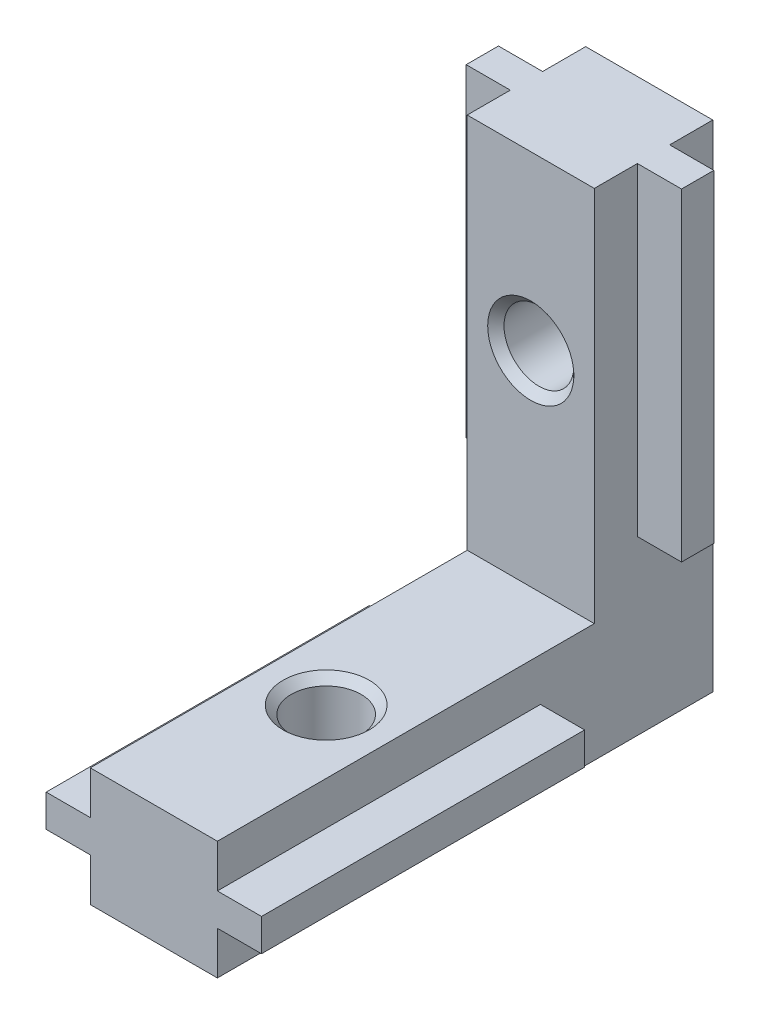
ISO-10303-21;
HEADER;
FILE_DESCRIPTION(('STEP AP214'),'2;1');
FILE_NAME('part.step','',(''),(''),'','','');
FILE_SCHEMA(('AUTOMOTIVE_DESIGN { 1 0 10303 214 1 1 1 1 }'));
ENDSEC;
DATA;
#1=APPLICATION_CONTEXT('core data for automotive mechanical design processes');
#2=APPLICATION_PROTOCOL_DEFINITION('international standard','automotive_design',2000,#1);
#3=PRODUCT_CONTEXT('',#1,'mechanical');
#4=PRODUCT('Part','Part','',(#3));
#5=PRODUCT_RELATED_PRODUCT_CATEGORY('part','',(#4));
#6=PRODUCT_DEFINITION_FORMATION('','',#4);
#7=PRODUCT_DEFINITION_CONTEXT('part definition',#1,'design');
#8=PRODUCT_DEFINITION('design','',#6,#7);
#9=PRODUCT_DEFINITION_SHAPE('','',#8);
#10=(LENGTH_UNIT() NAMED_UNIT(*) SI_UNIT(.MILLI.,.METRE.));
#11=(NAMED_UNIT(*) PLANE_ANGLE_UNIT() SI_UNIT($,.RADIAN.));
#12=(NAMED_UNIT(*) SI_UNIT($,.STERADIAN.) SOLID_ANGLE_UNIT());
#13=UNCERTAINTY_MEASURE_WITH_UNIT(LENGTH_MEASURE(1.E-05),#10,'distance_accuracy_value','');
#14=(GEOMETRIC_REPRESENTATION_CONTEXT(3) GLOBAL_UNCERTAINTY_ASSIGNED_CONTEXT((#13)) GLOBAL_UNIT_ASSIGNED_CONTEXT((#10,
#11,#12)) REPRESENTATION_CONTEXT('',''));
#15=CARTESIAN_POINT('',(0.,0.,0.));
#16=DIRECTION('',(0.,0.,1.));
#17=DIRECTION('',(1.,0.,0.));
#18=AXIS2_PLACEMENT_3D('',#15,#16,#17);
#19=CARTESIAN_POINT('',(2.95,5.5,23.));
#20=DIRECTION('',(0.,-1.,0.));
#21=DIRECTION('',(0.,0.,-1.));
#22=AXIS2_PLACEMENT_3D('',#19,#20,#21);
#23=PLANE('',#22);
#24=CARTESIAN_POINT('',(0.,5.5,15.));
#25=DIRECTION('',(0.,1.,0.));
#26=DIRECTION('',(0.,0.,1.));
#27=AXIS2_PLACEMENT_3D('',#24,#25,#26);
#28=CIRCLE('',#27,2.);
#29=CARTESIAN_POINT('',(0.,5.5,17.));
#30=VERTEX_POINT('',#29);
#31=EDGE_CURVE('E417',#30,#30,#28,.T.);
#32=ORIENTED_EDGE('',*,*,#31,.F.);
#33=EDGE_LOOP('',(#32));
#34=FACE_BOUND('',#33,.T.);
#35=DIRECTION('',(1.,0.,0.));
#36=VECTOR('',#35,1.);
#37=CARTESIAN_POINT('',(2.95,5.5,5.5));
#38=LINE('',#37,#36);
#39=CARTESIAN_POINT('',(-2.95,5.5,5.5));
#40=VERTEX_POINT('',#39);
#41=CARTESIAN_POINT('',(2.95,5.5,5.5));
#42=VERTEX_POINT('',#41);
#43=EDGE_CURVE('E24',#40,#42,#38,.T.);
#44=ORIENTED_EDGE('',*,*,#43,.F.);
#45=DIRECTION('',(0.,0.,-1.));
#46=VECTOR('',#45,1.);
#47=CARTESIAN_POINT('',(-2.95,5.5,23.));
#48=LINE('',#47,#46);
#49=CARTESIAN_POINT('',(-2.95,5.5,23.));
#50=VERTEX_POINT('',#49);
#51=EDGE_CURVE('E306',#50,#40,#48,.T.);
#52=ORIENTED_EDGE('',*,*,#51,.F.);
#53=DIRECTION('',(-1.,0.,0.));
#54=VECTOR('',#53,1.);
#55=CARTESIAN_POINT('',(2.95,5.5,23.));
#56=LINE('',#55,#54);
#57=CARTESIAN_POINT('',(2.95,5.5,23.));
#58=VERTEX_POINT('',#57);
#59=EDGE_CURVE('E304',#58,#50,#56,.T.);
#60=ORIENTED_EDGE('',*,*,#59,.F.);
#61=DIRECTION('',(0.,0.,-1.));
#62=VECTOR('',#61,1.);
#63=CARTESIAN_POINT('',(2.95,5.5,23.));
#64=LINE('',#63,#62);
#65=EDGE_CURVE('E317',#58,#42,#64,.T.);
#66=ORIENTED_EDGE('',*,*,#65,.T.);
#67=EDGE_LOOP('',(#44,#52,#60,#66));
#68=FACE_BOUND('',#67,.T.);
#69=ADVANCED_FACE('F16',(#34,#68),#23,.F.);
#70=CARTESIAN_POINT('',(-2.95,5.5,23.));
#71=DIRECTION('',(1.,0.,0.));
#72=DIRECTION('',(0.,0.,-1.));
#73=AXIS2_PLACEMENT_3D('',#70,#71,#72);
#74=PLANE('',#73);
#75=DIRECTION('',(0.,0.,1.));
#76=VECTOR('',#75,1.);
#77=CARTESIAN_POINT('',(-2.95,23.,0.));
#78=LINE('',#77,#76);
#79=CARTESIAN_POINT('',(-2.95,23.,3.5));
#80=VERTEX_POINT('',#79);
#81=CARTESIAN_POINT('',(-2.95,23.,5.5));
#82=VERTEX_POINT('',#81);
#83=EDGE_CURVE('E224',#80,#82,#78,.T.);
#84=ORIENTED_EDGE('',*,*,#83,.F.);
#85=DIRECTION('',(0.,-1.,0.));
#86=VECTOR('',#85,1.);
#87=CARTESIAN_POINT('',(-2.95,5.5,3.5));
#88=LINE('',#87,#86);
#89=CARTESIAN_POINT('',(-2.95,8.,3.5));
#90=VERTEX_POINT('',#89);
#91=EDGE_CURVE('E221',#80,#90,#88,.T.);
#92=ORIENTED_EDGE('',*,*,#91,.T.);
#93=DIRECTION('',(0.,0.,1.));
#94=VECTOR('',#93,1.);
#95=CARTESIAN_POINT('',(-2.95,8.,23.));
#96=LINE('',#95,#94);
#97=CARTESIAN_POINT('',(-2.95,8.,2.));
#98=VERTEX_POINT('',#97);
#99=EDGE_CURVE('E181',#98,#90,#96,.T.);
#100=ORIENTED_EDGE('',*,*,#99,.F.);
#101=DIRECTION('',(0.,1.,0.));
#102=VECTOR('',#101,1.);
#103=CARTESIAN_POINT('',(-2.95,5.5,2.));
#104=LINE('',#103,#102);
#105=CARTESIAN_POINT('',(-2.95,23.,2.));
#106=VERTEX_POINT('',#105);
#107=EDGE_CURVE('E215',#98,#106,#104,.T.);
#108=ORIENTED_EDGE('',*,*,#107,.T.);
#109=CARTESIAN_POINT('',(-2.95,23.,0.));
#110=VERTEX_POINT('',#109);
#111=EDGE_CURVE('E225',#110,#106,#78,.T.);
#112=ORIENTED_EDGE('',*,*,#111,.F.);
#113=DIRECTION('',(0.,-1.,0.));
#114=VECTOR('',#113,1.);
#115=CARTESIAN_POINT('',(-2.95,5.5,0.));
#116=LINE('',#115,#114);
#117=CARTESIAN_POINT('',(-2.95,0.,0.));
#118=VERTEX_POINT('',#117);
#119=EDGE_CURVE('E293',#110,#118,#116,.T.);
#120=ORIENTED_EDGE('',*,*,#119,.T.);
#121=DIRECTION('',(0.,0.,-1.));
#122=VECTOR('',#121,1.);
#123=CARTESIAN_POINT('',(-2.95,0.,23.));
#124=LINE('',#123,#122);
#125=CARTESIAN_POINT('',(-2.95,0.,23.));
#126=VERTEX_POINT('',#125);
#127=EDGE_CURVE('E321',#126,#118,#124,.T.);
#128=ORIENTED_EDGE('',*,*,#127,.F.);
#129=DIRECTION('',(0.,-1.,0.));
#130=VECTOR('',#129,1.);
#131=CARTESIAN_POINT('',(-2.95,5.5,23.));
#132=LINE('',#131,#130);
#133=CARTESIAN_POINT('',(-2.95,2.,23.));
#134=VERTEX_POINT('',#133);
#135=EDGE_CURVE('E298',#134,#126,#132,.T.);
#136=ORIENTED_EDGE('',*,*,#135,.F.);
#137=DIRECTION('',(0.,0.,-1.));
#138=VECTOR('',#137,1.);
#139=CARTESIAN_POINT('',(-2.95,2.,23.));
#140=LINE('',#139,#138);
#141=CARTESIAN_POINT('',(-2.95,2.,8.));
#142=VERTEX_POINT('',#141);
#143=EDGE_CURVE('E288',#134,#142,#140,.T.);
#144=ORIENTED_EDGE('',*,*,#143,.T.);
#145=DIRECTION('',(0.,-1.,0.));
#146=VECTOR('',#145,1.);
#147=CARTESIAN_POINT('',(-2.95,5.5,8.));
#148=LINE('',#147,#146);
#149=CARTESIAN_POINT('',(-2.95,3.5,8.));
#150=VERTEX_POINT('',#149);
#151=EDGE_CURVE('E291',#150,#142,#148,.T.);
#152=ORIENTED_EDGE('',*,*,#151,.F.);
#153=DIRECTION('',(0.,0.,1.));
#154=VECTOR('',#153,1.);
#155=CARTESIAN_POINT('',(-2.95,3.5,23.));
#156=LINE('',#155,#154);
#157=CARTESIAN_POINT('',(-2.95,3.5,23.));
#158=VERTEX_POINT('',#157);
#159=EDGE_CURVE('E282',#150,#158,#156,.T.);
#160=ORIENTED_EDGE('',*,*,#159,.T.);
#161=EDGE_CURVE('E294',#50,#158,#132,.T.);
#162=ORIENTED_EDGE('',*,*,#161,.F.);
#163=ORIENTED_EDGE('',*,*,#51,.T.);
#164=DIRECTION('',(0.,-1.,0.));
#165=VECTOR('',#164,1.);
#166=CARTESIAN_POINT('',(-2.95,23.,5.5));
#167=LINE('',#166,#165);
#168=EDGE_CURVE('E240',#82,#40,#167,.T.);
#169=ORIENTED_EDGE('',*,*,#168,.F.);
#170=EDGE_LOOP('',(#84,#92,#100,#108,#112,#120,#128,#136,#144,#152,#160,#162,#163,#169));
#171=FACE_BOUND('',#170,.T.);
#172=ADVANCED_FACE('F18',(#171),#74,.F.);
#173=CARTESIAN_POINT('',(-2.95,0.,23.));
#174=DIRECTION('',(0.,1.,0.));
#175=DIRECTION('',(0.,0.,1.));
#176=AXIS2_PLACEMENT_3D('',#173,#174,#175);
#177=PLANE('',#176);
#178=CARTESIAN_POINT('',(0.,0.,15.));
#179=DIRECTION('',(0.,1.,0.));
#180=DIRECTION('',(0.,0.,1.));
#181=AXIS2_PLACEMENT_3D('',#178,#179,#180);
#182=CIRCLE('',#181,2.);
#183=CARTESIAN_POINT('',(0.,0.,17.));
#184=VERTEX_POINT('',#183);
#185=EDGE_CURVE('E193',#184,#184,#182,.T.);
#186=ORIENTED_EDGE('',*,*,#185,.T.);
#187=EDGE_LOOP('',(#186));
#188=FACE_BOUND('',#187,.T.);
#189=DIRECTION('',(1.,0.,0.));
#190=VECTOR('',#189,1.);
#191=CARTESIAN_POINT('',(-2.95,0.,0.));
#192=LINE('',#191,#190);
#193=CARTESIAN_POINT('',(2.95,0.,0.));
#194=VERTEX_POINT('',#193);
#195=EDGE_CURVE('E309',#118,#194,#192,.T.);
#196=ORIENTED_EDGE('',*,*,#195,.T.);
#197=DIRECTION('',(0.,0.,-1.));
#198=VECTOR('',#197,1.);
#199=CARTESIAN_POINT('',(2.95,0.,23.));
#200=LINE('',#199,#198);
#201=CARTESIAN_POINT('',(2.95,0.,23.));
#202=VERTEX_POINT('',#201);
#203=EDGE_CURVE('E319',#202,#194,#200,.T.);
#204=ORIENTED_EDGE('',*,*,#203,.F.);
#205=DIRECTION('',(1.,0.,0.));
#206=VECTOR('',#205,1.);
#207=CARTESIAN_POINT('',(-2.95,0.,23.));
#208=LINE('',#207,#206);
#209=EDGE_CURVE('E297',#126,#202,#208,.T.);
#210=ORIENTED_EDGE('',*,*,#209,.F.);
#211=ORIENTED_EDGE('',*,*,#127,.T.);
#212=EDGE_LOOP('',(#196,#204,#210,#211));
#213=FACE_BOUND('',#212,.T.);
#214=ADVANCED_FACE('F369',(#188,#213),#177,.F.);
#215=CARTESIAN_POINT('',(2.95,0.,23.));
#216=DIRECTION('',(-1.,0.,0.));
#217=DIRECTION('',(0.,0.,1.));
#218=AXIS2_PLACEMENT_3D('',#215,#216,#217);
#219=PLANE('',#218);
#220=DIRECTION('',(0.,0.,-1.));
#221=VECTOR('',#220,1.);
#222=CARTESIAN_POINT('',(2.95,8.,23.));
#223=LINE('',#222,#221);
#224=CARTESIAN_POINT('',(2.95,8.,3.5));
#225=VERTEX_POINT('',#224);
#226=CARTESIAN_POINT('',(2.95,8.,2.));
#227=VERTEX_POINT('',#226);
#228=EDGE_CURVE('E11',#225,#227,#223,.T.);
#229=ORIENTED_EDGE('',*,*,#228,.F.);
#230=DIRECTION('',(0.,1.,0.));
#231=VECTOR('',#230,1.);
#232=CARTESIAN_POINT('',(2.95,0.,3.5));
#233=LINE('',#232,#231);
#234=CARTESIAN_POINT('',(2.95,23.,3.5));
#235=VERTEX_POINT('',#234);
#236=EDGE_CURVE('E218',#225,#235,#233,.T.);
#237=ORIENTED_EDGE('',*,*,#236,.T.);
#238=DIRECTION('',(0.,0.,-1.));
#239=VECTOR('',#238,1.);
#240=CARTESIAN_POINT('',(2.95,23.,5.5));
#241=LINE('',#240,#239);
#242=CARTESIAN_POINT('',(2.95,23.,5.5));
#243=VERTEX_POINT('',#242);
#244=EDGE_CURVE('E231',#243,#235,#241,.T.);
#245=ORIENTED_EDGE('',*,*,#244,.F.);
#246=DIRECTION('',(0.,-1.,0.));
#247=VECTOR('',#246,1.);
#248=CARTESIAN_POINT('',(2.95,23.,5.5));
#249=LINE('',#248,#247);
#250=EDGE_CURVE('E237',#243,#42,#249,.T.);
#251=ORIENTED_EDGE('',*,*,#250,.T.);
#252=ORIENTED_EDGE('',*,*,#65,.F.);
#253=DIRECTION('',(0.,1.,0.));
#254=VECTOR('',#253,1.);
#255=CARTESIAN_POINT('',(2.95,0.,23.));
#256=LINE('',#255,#254);
#257=CARTESIAN_POINT('',(2.95,3.5,23.));
#258=VERTEX_POINT('',#257);
#259=EDGE_CURVE('E300',#258,#58,#256,.T.);
#260=ORIENTED_EDGE('',*,*,#259,.F.);
#261=DIRECTION('',(0.,0.,-1.));
#262=VECTOR('',#261,1.);
#263=CARTESIAN_POINT('',(2.95,3.5,23.));
#264=LINE('',#263,#262);
#265=CARTESIAN_POINT('',(2.95,3.5,8.));
#266=VERTEX_POINT('',#265);
#267=EDGE_CURVE('E279',#258,#266,#264,.T.);
#268=ORIENTED_EDGE('',*,*,#267,.T.);
#269=DIRECTION('',(0.,1.,0.));
#270=VECTOR('',#269,1.);
#271=CARTESIAN_POINT('',(2.95,0.,8.));
#272=LINE('',#271,#270);
#273=CARTESIAN_POINT('',(2.95,2.,8.));
#274=VERTEX_POINT('',#273);
#275=EDGE_CURVE('E323',#274,#266,#272,.T.);
#276=ORIENTED_EDGE('',*,*,#275,.F.);
#277=DIRECTION('',(0.,0.,1.));
#278=VECTOR('',#277,1.);
#279=CARTESIAN_POINT('',(2.95,2.,23.));
#280=LINE('',#279,#278);
#281=CARTESIAN_POINT('',(2.95,2.,23.));
#282=VERTEX_POINT('',#281);
#283=EDGE_CURVE('E285',#274,#282,#280,.T.);
#284=ORIENTED_EDGE('',*,*,#283,.T.);
#285=EDGE_CURVE('E301',#202,#282,#256,.T.);
#286=ORIENTED_EDGE('',*,*,#285,.F.);
#287=ORIENTED_EDGE('',*,*,#203,.T.);
#288=DIRECTION('',(0.,1.,0.));
#289=VECTOR('',#288,1.);
#290=CARTESIAN_POINT('',(2.95,0.,0.));
#291=LINE('',#290,#289);
#292=CARTESIAN_POINT('',(2.95,23.,0.));
#293=VERTEX_POINT('',#292);
#294=EDGE_CURVE('E312',#194,#293,#291,.T.);
#295=ORIENTED_EDGE('',*,*,#294,.T.);
#296=CARTESIAN_POINT('',(2.95,23.,2.));
#297=VERTEX_POINT('',#296);
#298=EDGE_CURVE('E230',#297,#293,#241,.T.);
#299=ORIENTED_EDGE('',*,*,#298,.F.);
#300=DIRECTION('',(0.,-1.,0.));
#301=VECTOR('',#300,1.);
#302=CARTESIAN_POINT('',(2.95,0.,2.));
#303=LINE('',#302,#301);
#304=EDGE_CURVE('E172',#297,#227,#303,.T.);
#305=ORIENTED_EDGE('',*,*,#304,.T.);
#306=EDGE_LOOP('',(#229,#237,#245,#251,#252,#260,#268,#276,#284,#286,#287,#295,#299,#305));
#307=FACE_BOUND('',#306,.T.);
#308=ADVANCED_FACE('F336',(#307),#219,.F.);
#309=CARTESIAN_POINT('',(0.,0.,23.));
#310=DIRECTION('',(0.,0.,1.));
#311=DIRECTION('',(1.,0.,0.));
#312=AXIS2_PLACEMENT_3D('',#309,#310,#311);
#313=PLANE('',#312);
#314=ORIENTED_EDGE('',*,*,#161,.T.);
#315=DIRECTION('',(-1.,0.,0.));
#316=VECTOR('',#315,1.);
#317=CARTESIAN_POINT('',(5.,3.5,23.));
#318=LINE('',#317,#316);
#319=CARTESIAN_POINT('',(-5.,3.5,23.));
#320=VERTEX_POINT('',#319);
#321=EDGE_CURVE('E268',#158,#320,#318,.T.);
#322=ORIENTED_EDGE('',*,*,#321,.T.);
#323=DIRECTION('',(0.,-1.,0.));
#324=VECTOR('',#323,1.);
#325=CARTESIAN_POINT('',(-5.,3.5,23.));
#326=LINE('',#325,#324);
#327=CARTESIAN_POINT('',(-5.,2.,23.));
#328=VERTEX_POINT('',#327);
#329=EDGE_CURVE('E243',#320,#328,#326,.T.);
#330=ORIENTED_EDGE('',*,*,#329,.T.);
#331=DIRECTION('',(1.,0.,0.));
#332=VECTOR('',#331,1.);
#333=CARTESIAN_POINT('',(-5.,2.,23.));
#334=LINE('',#333,#332);
#335=EDGE_CURVE('E263',#328,#134,#334,.T.);
#336=ORIENTED_EDGE('',*,*,#335,.T.);
#337=ORIENTED_EDGE('',*,*,#135,.T.);
#338=ORIENTED_EDGE('',*,*,#209,.T.);
#339=ORIENTED_EDGE('',*,*,#285,.T.);
#340=CARTESIAN_POINT('',(5.,2.,23.));
#341=VERTEX_POINT('',#340);
#342=EDGE_CURVE('E262',#282,#341,#334,.T.);
#343=ORIENTED_EDGE('',*,*,#342,.T.);
#344=DIRECTION('',(0.,1.,0.));
#345=VECTOR('',#344,1.);
#346=CARTESIAN_POINT('',(5.,2.,23.));
#347=LINE('',#346,#345);
#348=CARTESIAN_POINT('',(5.,3.5,23.));
#349=VERTEX_POINT('',#348);
#350=EDGE_CURVE('E265',#341,#349,#347,.T.);
#351=ORIENTED_EDGE('',*,*,#350,.T.);
#352=EDGE_CURVE('E248',#349,#258,#318,.T.);
#353=ORIENTED_EDGE('',*,*,#352,.T.);
#354=ORIENTED_EDGE('',*,*,#259,.T.);
#355=ORIENTED_EDGE('',*,*,#59,.T.);
#356=EDGE_LOOP('',(#314,#322,#330,#336,#337,#338,#339,#343,#351,#353,#354,#355));
#357=FACE_BOUND('',#356,.T.);
#358=ADVANCED_FACE('F344',(#357),#313,.T.);
#359=CARTESIAN_POINT('',(0.,0.,0.));
#360=DIRECTION('',(0.,0.,1.));
#361=DIRECTION('',(1.,0.,0.));
#362=AXIS2_PLACEMENT_3D('',#359,#360,#361);
#363=PLANE('',#362);
#364=CARTESIAN_POINT('',(0.,15.,0.));
#365=DIRECTION('',(0.,0.,-1.));
#366=DIRECTION('',(-1.,0.,0.));
#367=AXIS2_PLACEMENT_3D('',#364,#365,#366);
#368=CIRCLE('',#367,2.);
#369=CARTESIAN_POINT('',(-2.,15.,0.));
#370=VERTEX_POINT('',#369);
#371=EDGE_CURVE('E431',#370,#370,#368,.T.);
#372=ORIENTED_EDGE('',*,*,#371,.F.);
#373=EDGE_LOOP('',(#372));
#374=FACE_BOUND('',#373,.T.);
#375=ORIENTED_EDGE('',*,*,#119,.F.);
#376=DIRECTION('',(-1.,0.,0.));
#377=VECTOR('',#376,1.);
#378=CARTESIAN_POINT('',(2.95,23.,0.));
#379=LINE('',#378,#377);
#380=EDGE_CURVE('E234',#293,#110,#379,.T.);
#381=ORIENTED_EDGE('',*,*,#380,.F.);
#382=ORIENTED_EDGE('',*,*,#294,.F.);
#383=ORIENTED_EDGE('',*,*,#195,.F.);
#384=EDGE_LOOP('',(#375,#381,#382,#383));
#385=FACE_BOUND('',#384,.T.);
#386=ADVANCED_FACE('F372',(#374,#385),#363,.F.);
#387=CARTESIAN_POINT('',(5.,2.,8.));
#388=DIRECTION('',(1.,0.,0.));
#389=DIRECTION('',(0.,0.,-1.));
#390=AXIS2_PLACEMENT_3D('',#387,#388,#389);
#391=PLANE('',#390);
#392=ORIENTED_EDGE('',*,*,#350,.F.);
#393=DIRECTION('',(0.,0.,1.));
#394=VECTOR('',#393,1.);
#395=CARTESIAN_POINT('',(5.,2.,8.));
#396=LINE('',#395,#394);
#397=CARTESIAN_POINT('',(5.,2.,8.));
#398=VERTEX_POINT('',#397);
#399=EDGE_CURVE('E274',#398,#341,#396,.T.);
#400=ORIENTED_EDGE('',*,*,#399,.F.);
#401=DIRECTION('',(0.,1.,0.));
#402=VECTOR('',#401,1.);
#403=CARTESIAN_POINT('',(5.,2.,8.));
#404=LINE('',#403,#402);
#405=CARTESIAN_POINT('',(5.,3.5,8.));
#406=VERTEX_POINT('',#405);
#407=EDGE_CURVE('E252',#398,#406,#404,.T.);
#408=ORIENTED_EDGE('',*,*,#407,.T.);
#409=DIRECTION('',(0.,0.,1.));
#410=VECTOR('',#409,1.);
#411=CARTESIAN_POINT('',(5.,3.5,8.));
#412=LINE('',#411,#410);
#413=EDGE_CURVE('E272',#406,#349,#412,.T.);
#414=ORIENTED_EDGE('',*,*,#413,.T.);
#415=EDGE_LOOP('',(#392,#400,#408,#414));
#416=FACE_BOUND('',#415,.T.);
#417=ADVANCED_FACE('F360',(#416),#391,.T.);
#418=CARTESIAN_POINT('',(0.,0.,8.));
#419=DIRECTION('',(0.,0.,1.));
#420=DIRECTION('',(1.,0.,0.));
#421=AXIS2_PLACEMENT_3D('',#418,#419,#420);
#422=PLANE('',#421);
#423=DIRECTION('',(1.,0.,0.));
#424=VECTOR('',#423,1.);
#425=CARTESIAN_POINT('',(-5.,2.,8.));
#426=LINE('',#425,#424);
#427=EDGE_CURVE('E247',#274,#398,#426,.T.);
#428=ORIENTED_EDGE('',*,*,#427,.F.);
#429=ORIENTED_EDGE('',*,*,#275,.T.);
#430=DIRECTION('',(-1.,0.,0.));
#431=VECTOR('',#430,1.);
#432=CARTESIAN_POINT('',(5.,3.5,8.));
#433=LINE('',#432,#431);
#434=EDGE_CURVE('E256',#406,#266,#433,.T.);
#435=ORIENTED_EDGE('',*,*,#434,.F.);
#436=ORIENTED_EDGE('',*,*,#407,.F.);
#437=EDGE_LOOP('',(#428,#429,#435,#436));
#438=FACE_BOUND('',#437,.T.);
#439=ADVANCED_FACE('F354',(#438),#422,.F.);
#440=CARTESIAN_POINT('',(5.,3.5,8.));
#441=DIRECTION('',(0.,1.,0.));
#442=DIRECTION('',(0.,0.,1.));
#443=AXIS2_PLACEMENT_3D('',#440,#441,#442);
#444=PLANE('',#443);
#445=ORIENTED_EDGE('',*,*,#267,.F.);
#446=ORIENTED_EDGE('',*,*,#352,.F.);
#447=ORIENTED_EDGE('',*,*,#413,.F.);
#448=ORIENTED_EDGE('',*,*,#434,.T.);
#449=EDGE_LOOP('',(#445,#446,#447,#448));
#450=FACE_BOUND('',#449,.T.);
#451=ADVANCED_FACE('F349',(#450),#444,.T.);
#452=CARTESIAN_POINT('',(-5.,2.,8.));
#453=DIRECTION('',(0.,-1.,0.));
#454=DIRECTION('',(0.,0.,-1.));
#455=AXIS2_PLACEMENT_3D('',#452,#453,#454);
#456=PLANE('',#455);
#457=ORIENTED_EDGE('',*,*,#283,.F.);
#458=ORIENTED_EDGE('',*,*,#427,.T.);
#459=ORIENTED_EDGE('',*,*,#399,.T.);
#460=ORIENTED_EDGE('',*,*,#342,.F.);
#461=EDGE_LOOP('',(#457,#458,#459,#460));
#462=FACE_BOUND('',#461,.T.);
#463=ADVANCED_FACE('F357',(#462),#456,.T.);
#464=CARTESIAN_POINT('',(-5.,3.5,8.));
#465=VERTEX_POINT('',#464);
#466=EDGE_CURVE('E255',#150,#465,#433,.T.);
#467=ORIENTED_EDGE('',*,*,#466,.F.);
#468=ORIENTED_EDGE('',*,*,#151,.T.);
#469=CARTESIAN_POINT('',(-5.,2.,8.));
#470=VERTEX_POINT('',#469);
#471=EDGE_CURVE('E249',#470,#142,#426,.T.);
#472=ORIENTED_EDGE('',*,*,#471,.F.);
#473=DIRECTION('',(0.,-1.,0.));
#474=VECTOR('',#473,1.);
#475=CARTESIAN_POINT('',(-5.,3.5,8.));
#476=LINE('',#475,#474);
#477=EDGE_CURVE('E244',#465,#470,#476,.T.);
#478=ORIENTED_EDGE('',*,*,#477,.F.);
#479=EDGE_LOOP('',(#467,#468,#472,#478));
#480=FACE_BOUND('',#479,.T.);
#481=ADVANCED_FACE('F454',(#480),#422,.F.);
#482=ORIENTED_EDGE('',*,*,#143,.F.);
#483=ORIENTED_EDGE('',*,*,#335,.F.);
#484=DIRECTION('',(0.,0.,1.));
#485=VECTOR('',#484,1.);
#486=CARTESIAN_POINT('',(-5.,2.,8.));
#487=LINE('',#486,#485);
#488=EDGE_CURVE('E277',#470,#328,#487,.T.);
#489=ORIENTED_EDGE('',*,*,#488,.F.);
#490=ORIENTED_EDGE('',*,*,#471,.T.);
#491=EDGE_LOOP('',(#482,#483,#489,#490));
#492=FACE_BOUND('',#491,.T.);
#493=ADVANCED_FACE('F452',(#492),#456,.T.);
#494=ORIENTED_EDGE('',*,*,#159,.F.);
#495=ORIENTED_EDGE('',*,*,#466,.T.);
#496=DIRECTION('',(0.,0.,1.));
#497=VECTOR('',#496,1.);
#498=CARTESIAN_POINT('',(-5.,3.5,8.));
#499=LINE('',#498,#497);
#500=EDGE_CURVE('E259',#465,#320,#499,.T.);
#501=ORIENTED_EDGE('',*,*,#500,.T.);
#502=ORIENTED_EDGE('',*,*,#321,.F.);
#503=EDGE_LOOP('',(#494,#495,#501,#502));
#504=FACE_BOUND('',#503,.T.);
#505=ADVANCED_FACE('F450',(#504),#444,.T.);
#506=CARTESIAN_POINT('',(-5.,3.5,8.));
#507=DIRECTION('',(-1.,0.,0.));
#508=DIRECTION('',(0.,0.,1.));
#509=AXIS2_PLACEMENT_3D('',#506,#507,#508);
#510=PLANE('',#509);
#511=ORIENTED_EDGE('',*,*,#329,.F.);
#512=ORIENTED_EDGE('',*,*,#500,.F.);
#513=ORIENTED_EDGE('',*,*,#477,.T.);
#514=ORIENTED_EDGE('',*,*,#488,.T.);
#515=EDGE_LOOP('',(#511,#512,#513,#514));
#516=FACE_BOUND('',#515,.T.);
#517=ADVANCED_FACE('F447',(#516),#510,.T.);
#518=CARTESIAN_POINT('',(-2.95,23.,5.5));
#519=DIRECTION('',(0.,0.,-1.));
#520=DIRECTION('',(-1.,0.,0.));
#521=AXIS2_PLACEMENT_3D('',#518,#519,#520);
#522=PLANE('',#521);
#523=CARTESIAN_POINT('',(0.,15.,5.5));
#524=DIRECTION('',(0.,0.,-1.));
#525=DIRECTION('',(-1.,0.,0.));
#526=AXIS2_PLACEMENT_3D('',#523,#524,#525);
#527=CIRCLE('',#526,2.);
#528=CARTESIAN_POINT('',(-2.,15.,5.5));
#529=VERTEX_POINT('',#528);
#530=EDGE_CURVE('E422',#529,#529,#527,.T.);
#531=ORIENTED_EDGE('',*,*,#530,.T.);
#532=EDGE_LOOP('',(#531));
#533=FACE_BOUND('',#532,.T.);
#534=ORIENTED_EDGE('',*,*,#168,.T.);
#535=ORIENTED_EDGE('',*,*,#43,.T.);
#536=ORIENTED_EDGE('',*,*,#250,.F.);
#537=DIRECTION('',(1.,0.,0.));
#538=VECTOR('',#537,1.);
#539=CARTESIAN_POINT('',(-2.95,23.,5.5));
#540=LINE('',#539,#538);
#541=EDGE_CURVE('E228',#82,#243,#540,.T.);
#542=ORIENTED_EDGE('',*,*,#541,.F.);
#543=EDGE_LOOP('',(#534,#535,#536,#542));
#544=FACE_BOUND('',#543,.T.);
#545=ADVANCED_FACE('F327',(#533,#544),#522,.F.);
#546=CARTESIAN_POINT('',(0.,23.,0.));
#547=DIRECTION('',(0.,1.,0.));
#548=DIRECTION('',(0.,0.,1.));
#549=AXIS2_PLACEMENT_3D('',#546,#547,#548);
#550=PLANE('',#549);
#551=ORIENTED_EDGE('',*,*,#111,.T.);
#552=DIRECTION('',(-1.,0.,0.));
#553=VECTOR('',#552,1.);
#554=CARTESIAN_POINT('',(5.,23.,2.));
#555=LINE('',#554,#553);
#556=CARTESIAN_POINT('',(-5.,23.,2.));
#557=VERTEX_POINT('',#556);
#558=EDGE_CURVE('E190',#106,#557,#555,.T.);
#559=ORIENTED_EDGE('',*,*,#558,.T.);
#560=DIRECTION('',(0.,0.,1.));
#561=VECTOR('',#560,1.);
#562=CARTESIAN_POINT('',(-5.,23.,2.));
#563=LINE('',#562,#561);
#564=CARTESIAN_POINT('',(-5.,23.,3.5));
#565=VERTEX_POINT('',#564);
#566=EDGE_CURVE('E202',#557,#565,#563,.T.);
#567=ORIENTED_EDGE('',*,*,#566,.T.);
#568=DIRECTION('',(1.,0.,0.));
#569=VECTOR('',#568,1.);
#570=CARTESIAN_POINT('',(-5.,23.,3.5));
#571=LINE('',#570,#569);
#572=EDGE_CURVE('E38',#565,#80,#571,.T.);
#573=ORIENTED_EDGE('',*,*,#572,.T.);
#574=ORIENTED_EDGE('',*,*,#83,.T.);
#575=ORIENTED_EDGE('',*,*,#541,.T.);
#576=ORIENTED_EDGE('',*,*,#244,.T.);
#577=CARTESIAN_POINT('',(5.,23.,3.5));
#578=VERTEX_POINT('',#577);
#579=EDGE_CURVE('E204',#235,#578,#571,.T.);
#580=ORIENTED_EDGE('',*,*,#579,.T.);
#581=DIRECTION('',(0.,0.,-1.));
#582=VECTOR('',#581,1.);
#583=CARTESIAN_POINT('',(5.,23.,3.5));
#584=LINE('',#583,#582);
#585=CARTESIAN_POINT('',(5.,23.,2.));
#586=VERTEX_POINT('',#585);
#587=EDGE_CURVE('E206',#578,#586,#584,.T.);
#588=ORIENTED_EDGE('',*,*,#587,.T.);
#589=EDGE_CURVE('E31',#586,#297,#555,.T.);
#590=ORIENTED_EDGE('',*,*,#589,.T.);
#591=ORIENTED_EDGE('',*,*,#298,.T.);
#592=ORIENTED_EDGE('',*,*,#380,.T.);
#593=EDGE_LOOP('',(#551,#559,#567,#573,#574,#575,#576,#580,#588,#590,#591,#592));
#594=FACE_BOUND('',#593,.T.);
#595=ADVANCED_FACE('F339',(#594),#550,.T.);
#596=CARTESIAN_POINT('',(5.,8.,3.5));
#597=DIRECTION('',(1.,0.,0.));
#598=DIRECTION('',(0.,0.,-1.));
#599=AXIS2_PLACEMENT_3D('',#596,#597,#598);
#600=PLANE('',#599);
#601=ORIENTED_EDGE('',*,*,#587,.F.);
#602=DIRECTION('',(0.,1.,0.));
#603=VECTOR('',#602,1.);
#604=CARTESIAN_POINT('',(5.,8.,3.5));
#605=LINE('',#604,#603);
#606=CARTESIAN_POINT('',(5.,8.,3.5));
#607=VERTEX_POINT('',#606);
#608=EDGE_CURVE('E173',#607,#578,#605,.T.);
#609=ORIENTED_EDGE('',*,*,#608,.F.);
#610=DIRECTION('',(0.,0.,-1.));
#611=VECTOR('',#610,1.);
#612=CARTESIAN_POINT('',(5.,8.,3.5));
#613=LINE('',#612,#611);
#614=CARTESIAN_POINT('',(5.,8.,2.));
#615=VERTEX_POINT('',#614);
#616=EDGE_CURVE('E182',#607,#615,#613,.T.);
#617=ORIENTED_EDGE('',*,*,#616,.T.);
#618=DIRECTION('',(0.,1.,0.));
#619=VECTOR('',#618,1.);
#620=CARTESIAN_POINT('',(5.,8.,2.));
#621=LINE('',#620,#619);
#622=EDGE_CURVE('E209',#615,#586,#621,.T.);
#623=ORIENTED_EDGE('',*,*,#622,.T.);
#624=EDGE_LOOP('',(#601,#609,#617,#623));
#625=FACE_BOUND('',#624,.T.);
#626=ADVANCED_FACE('F467',(#625),#600,.T.);
#627=CARTESIAN_POINT('',(0.,8.,0.));
#628=DIRECTION('',(0.,1.,0.));
#629=DIRECTION('',(0.,0.,1.));
#630=AXIS2_PLACEMENT_3D('',#627,#628,#629);
#631=PLANE('',#630);
#632=DIRECTION('',(1.,0.,0.));
#633=VECTOR('',#632,1.);
#634=CARTESIAN_POINT('',(-5.,8.,3.5));
#635=LINE('',#634,#633);
#636=EDGE_CURVE('E183',#225,#607,#635,.T.);
#637=ORIENTED_EDGE('',*,*,#636,.F.);
#638=ORIENTED_EDGE('',*,*,#228,.T.);
#639=DIRECTION('',(-1.,0.,0.));
#640=VECTOR('',#639,1.);
#641=CARTESIAN_POINT('',(5.,8.,2.));
#642=LINE('',#641,#640);
#643=EDGE_CURVE('E199',#615,#227,#642,.T.);
#644=ORIENTED_EDGE('',*,*,#643,.F.);
#645=ORIENTED_EDGE('',*,*,#616,.F.);
#646=EDGE_LOOP('',(#637,#638,#644,#645));
#647=FACE_BOUND('',#646,.T.);
#648=ADVANCED_FACE('F391',(#647),#631,.F.);
#649=CARTESIAN_POINT('',(5.,8.,2.));
#650=DIRECTION('',(0.,0.,-1.));
#651=DIRECTION('',(-1.,0.,0.));
#652=AXIS2_PLACEMENT_3D('',#649,#650,#651);
#653=PLANE('',#652);
#654=ORIENTED_EDGE('',*,*,#304,.F.);
#655=ORIENTED_EDGE('',*,*,#589,.F.);
#656=ORIENTED_EDGE('',*,*,#622,.F.);
#657=ORIENTED_EDGE('',*,*,#643,.T.);
#658=EDGE_LOOP('',(#654,#655,#656,#657));
#659=FACE_BOUND('',#658,.T.);
#660=ADVANCED_FACE('F378',(#659),#653,.T.);
#661=CARTESIAN_POINT('',(-5.,8.,3.5));
#662=DIRECTION('',(0.,0.,1.));
#663=DIRECTION('',(1.,0.,0.));
#664=AXIS2_PLACEMENT_3D('',#661,#662,#663);
#665=PLANE('',#664);
#666=ORIENTED_EDGE('',*,*,#236,.F.);
#667=ORIENTED_EDGE('',*,*,#636,.T.);
#668=ORIENTED_EDGE('',*,*,#608,.T.);
#669=ORIENTED_EDGE('',*,*,#579,.F.);
#670=EDGE_LOOP('',(#666,#667,#668,#669));
#671=FACE_BOUND('',#670,.T.);
#672=ADVANCED_FACE('F387',(#671),#665,.T.);
#673=CARTESIAN_POINT('',(-5.,8.,2.));
#674=VERTEX_POINT('',#673);
#675=EDGE_CURVE('E198',#98,#674,#642,.T.);
#676=ORIENTED_EDGE('',*,*,#675,.F.);
#677=ORIENTED_EDGE('',*,*,#99,.T.);
#678=CARTESIAN_POINT('',(-5.,8.,3.5));
#679=VERTEX_POINT('',#678);
#680=EDGE_CURVE('E167',#679,#90,#635,.T.);
#681=ORIENTED_EDGE('',*,*,#680,.F.);
#682=DIRECTION('',(0.,0.,1.));
#683=VECTOR('',#682,1.);
#684=CARTESIAN_POINT('',(-5.,8.,2.));
#685=LINE('',#684,#683);
#686=EDGE_CURVE('E179',#674,#679,#685,.T.);
#687=ORIENTED_EDGE('',*,*,#686,.F.);
#688=EDGE_LOOP('',(#676,#677,#681,#687));
#689=FACE_BOUND('',#688,.T.);
#690=ADVANCED_FACE('F178',(#689),#631,.F.);
#691=ORIENTED_EDGE('',*,*,#91,.F.);
#692=ORIENTED_EDGE('',*,*,#572,.F.);
#693=DIRECTION('',(0.,1.,0.));
#694=VECTOR('',#693,1.);
#695=CARTESIAN_POINT('',(-5.,8.,3.5));
#696=LINE('',#695,#694);
#697=EDGE_CURVE('E164',#679,#565,#696,.T.);
#698=ORIENTED_EDGE('',*,*,#697,.F.);
#699=ORIENTED_EDGE('',*,*,#680,.T.);
#700=EDGE_LOOP('',(#691,#692,#698,#699));
#701=FACE_BOUND('',#700,.T.);
#702=ADVANCED_FACE('F166',(#701),#665,.T.);
#703=ORIENTED_EDGE('',*,*,#107,.F.);
#704=ORIENTED_EDGE('',*,*,#675,.T.);
#705=DIRECTION('',(0.,1.,0.));
#706=VECTOR('',#705,1.);
#707=CARTESIAN_POINT('',(-5.,8.,2.));
#708=LINE('',#707,#706);
#709=EDGE_CURVE('E188',#674,#557,#708,.T.);
#710=ORIENTED_EDGE('',*,*,#709,.T.);
#711=ORIENTED_EDGE('',*,*,#558,.F.);
#712=EDGE_LOOP('',(#703,#704,#710,#711));
#713=FACE_BOUND('',#712,.T.);
#714=ADVANCED_FACE('F375',(#713),#653,.T.);
#715=CARTESIAN_POINT('',(-5.,8.,2.));
#716=DIRECTION('',(-1.,0.,0.));
#717=DIRECTION('',(0.,0.,1.));
#718=AXIS2_PLACEMENT_3D('',#715,#716,#717);
#719=PLANE('',#718);
#720=ORIENTED_EDGE('',*,*,#566,.F.);
#721=ORIENTED_EDGE('',*,*,#709,.F.);
#722=ORIENTED_EDGE('',*,*,#686,.T.);
#723=ORIENTED_EDGE('',*,*,#697,.T.);
#724=EDGE_LOOP('',(#720,#721,#722,#723));
#725=FACE_BOUND('',#724,.T.);
#726=ADVANCED_FACE('F186',(#725),#719,.T.);
#727=CARTESIAN_POINT('',(0.,0.,15.));
#728=DIRECTION('',(0.,-1.,0.));
#729=DIRECTION('',(0.,0.,-1.));
#730=AXIS2_PLACEMENT_3D('',#727,#728,#729);
#731=CONICAL_SURFACE('',#730,2.,0.785398163397438);
#732=CARTESIAN_POINT('',(0.,0.379000000000008,15.));
#733=DIRECTION('',(0.,1.,0.));
#734=DIRECTION('',(0.,0.,1.));
#735=AXIS2_PLACEMENT_3D('',#732,#733,#734);
#736=CIRCLE('',#735,1.621);
#737=CARTESIAN_POINT('',(0.,0.379000000000008,16.621));
#738=VERTEX_POINT('',#737);
#739=EDGE_CURVE('E411',#738,#738,#736,.T.);
#740=ORIENTED_EDGE('',*,*,#739,.T.);
#741=EDGE_LOOP('',(#740));
#742=FACE_BOUND('',#741,.T.);
#743=ORIENTED_EDGE('',*,*,#185,.F.);
#744=EDGE_LOOP('',(#743));
#745=FACE_BOUND('',#744,.T.);
#746=ADVANCED_FACE('F384',(#742,#745),#731,.F.);
#747=CARTESIAN_POINT('',(0.,5.5,15.));
#748=DIRECTION('',(0.,1.,0.));
#749=DIRECTION('',(0.,0.,1.));
#750=AXIS2_PLACEMENT_3D('',#747,#748,#749);
#751=CYLINDRICAL_SURFACE('',#750,1.621);
#752=CARTESIAN_POINT('',(0.,5.121,15.));
#753=DIRECTION('',(0.,1.,0.));
#754=DIRECTION('',(0.,0.,1.));
#755=AXIS2_PLACEMENT_3D('',#752,#753,#754);
#756=CIRCLE('',#755,1.621);
#757=CARTESIAN_POINT('',(0.,5.121,16.621));
#758=VERTEX_POINT('',#757);
#759=EDGE_CURVE('E413',#758,#758,#756,.T.);
#760=ORIENTED_EDGE('',*,*,#759,.T.);
#761=EDGE_LOOP('',(#760));
#762=FACE_BOUND('',#761,.T.);
#763=ORIENTED_EDGE('',*,*,#739,.F.);
#764=EDGE_LOOP('',(#763));
#765=FACE_BOUND('',#764,.T.);
#766=ADVANCED_FACE('F489',(#762,#765),#751,.F.);
#767=CARTESIAN_POINT('',(0.,5.121,15.));
#768=DIRECTION('',(0.,1.,0.));
#769=DIRECTION('',(0.,0.,1.));
#770=AXIS2_PLACEMENT_3D('',#767,#768,#769);
#771=CONICAL_SURFACE('',#770,1.621,0.785398163397457);
#772=ORIENTED_EDGE('',*,*,#31,.T.);
#773=EDGE_LOOP('',(#772));
#774=FACE_BOUND('',#773,.T.);
#775=ORIENTED_EDGE('',*,*,#759,.F.);
#776=EDGE_LOOP('',(#775));
#777=FACE_BOUND('',#776,.T.);
#778=ADVANCED_FACE('F492',(#774,#777),#771,.F.);
#779=CARTESIAN_POINT('',(0.,15.,5.5));
#780=DIRECTION('',(0.,0.,1.));
#781=DIRECTION('',(1.,0.,0.));
#782=AXIS2_PLACEMENT_3D('',#779,#780,#781);
#783=CONICAL_SURFACE('',#782,2.,0.785398163397457);
#784=CARTESIAN_POINT('',(0.,15.,5.121));
#785=DIRECTION('',(0.,0.,-1.));
#786=DIRECTION('',(-1.,0.,0.));
#787=AXIS2_PLACEMENT_3D('',#784,#785,#786);
#788=CIRCLE('',#787,1.621);
#789=CARTESIAN_POINT('',(-1.621,15.,5.121));
#790=VERTEX_POINT('',#789);
#791=EDGE_CURVE('E425',#790,#790,#788,.T.);
#792=ORIENTED_EDGE('',*,*,#791,.T.);
#793=EDGE_LOOP('',(#792));
#794=FACE_BOUND('',#793,.T.);
#795=ORIENTED_EDGE('',*,*,#530,.F.);
#796=EDGE_LOOP('',(#795));
#797=FACE_BOUND('',#796,.T.);
#798=ADVANCED_FACE('F496',(#794,#797),#783,.F.);
#799=CARTESIAN_POINT('',(0.,15.,0.));
#800=DIRECTION('',(0.,0.,-1.));
#801=DIRECTION('',(-1.,0.,0.));
#802=AXIS2_PLACEMENT_3D('',#799,#800,#801);
#803=CYLINDRICAL_SURFACE('',#802,1.621);
#804=CARTESIAN_POINT('',(0.,15.,0.379));
#805=DIRECTION('',(0.,0.,-1.));
#806=DIRECTION('',(-1.,0.,0.));
#807=AXIS2_PLACEMENT_3D('',#804,#805,#806);
#808=CIRCLE('',#807,1.621);
#809=CARTESIAN_POINT('',(-1.621,15.,0.379));
#810=VERTEX_POINT('',#809);
#811=EDGE_CURVE('E428',#810,#810,#808,.T.);
#812=ORIENTED_EDGE('',*,*,#811,.T.);
#813=EDGE_LOOP('',(#812));
#814=FACE_BOUND('',#813,.T.);
#815=ORIENTED_EDGE('',*,*,#791,.F.);
#816=EDGE_LOOP('',(#815));
#817=FACE_BOUND('',#816,.T.);
#818=ADVANCED_FACE('F500',(#814,#817),#803,.F.);
#819=CARTESIAN_POINT('',(0.,15.,0.379));
#820=DIRECTION('',(0.,0.,-1.));
#821=DIRECTION('',(-1.,0.,0.));
#822=AXIS2_PLACEMENT_3D('',#819,#820,#821);
#823=CONICAL_SURFACE('',#822,1.621,0.785398163397456);
#824=ORIENTED_EDGE('',*,*,#371,.T.);
#825=EDGE_LOOP('',(#824));
#826=FACE_BOUND('',#825,.T.);
#827=ORIENTED_EDGE('',*,*,#811,.F.);
#828=EDGE_LOOP('',(#827));
#829=FACE_BOUND('',#828,.T.);
#830=ADVANCED_FACE('F435',(#826,#829),#823,.F.);
#831=CLOSED_SHELL('',(#69,#172,#214,#308,#358,#386,#417,#439,#451,#463,#481,#493,#505,#517,#545,
#595,#626,#648,#660,#672,#690,#702,#714,#726,#746,#766,#778,#798,#818,#830));
#832=MANIFOLD_SOLID_BREP('B1',#831);
#833=ADVANCED_BREP_SHAPE_REPRESENTATION('',(#18,#832),#14);
#834=SHAPE_DEFINITION_REPRESENTATION(#9,#833);
ENDSEC;
END-ISO-10303-21;
